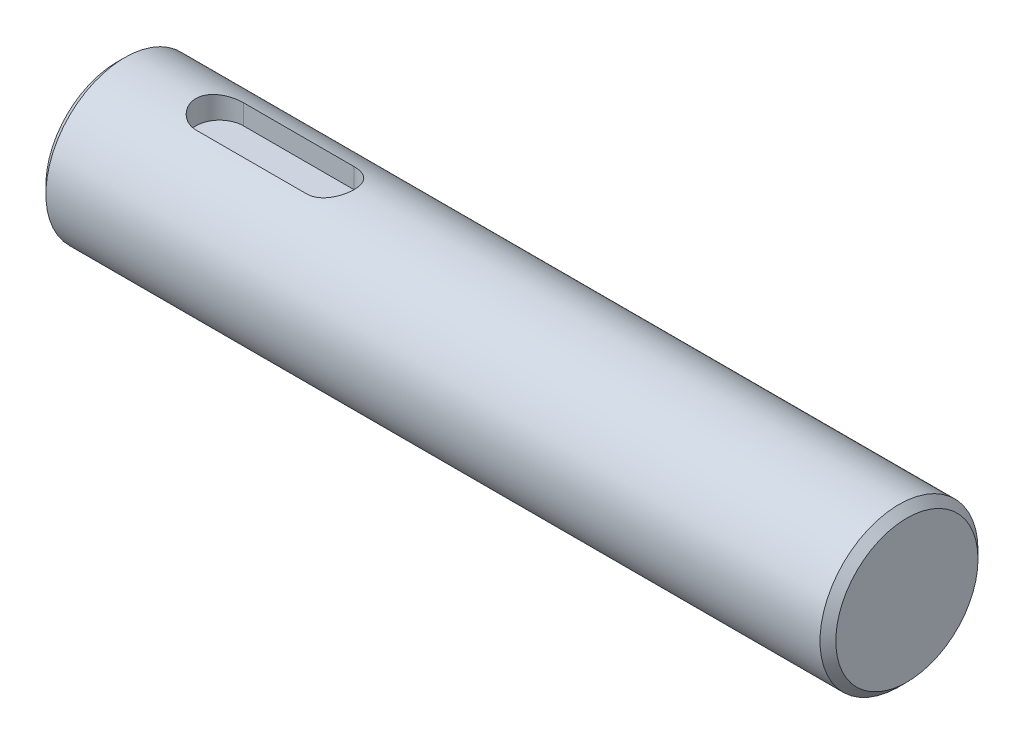
ISO-10303-21;
HEADER;
FILE_DESCRIPTION(('STEP AP214'),'2;1');
FILE_NAME('part.step','',(''),(''),'','','');
FILE_SCHEMA(('AUTOMOTIVE_DESIGN { 1 0 10303 214 1 1 1 1 }'));
ENDSEC;
DATA;
#1=APPLICATION_CONTEXT('core data for automotive mechanical design processes');
#2=APPLICATION_PROTOCOL_DEFINITION('international standard','automotive_design',2000,#1);
#3=PRODUCT_CONTEXT('',#1,'mechanical');
#4=PRODUCT('Part','Part','',(#3));
#5=PRODUCT_RELATED_PRODUCT_CATEGORY('part','',(#4));
#6=PRODUCT_DEFINITION_FORMATION('','',#4);
#7=PRODUCT_DEFINITION_CONTEXT('part definition',#1,'design');
#8=PRODUCT_DEFINITION('design','',#6,#7);
#9=PRODUCT_DEFINITION_SHAPE('','',#8);
#10=(LENGTH_UNIT() NAMED_UNIT(*) SI_UNIT(.MILLI.,.METRE.));
#11=(NAMED_UNIT(*) PLANE_ANGLE_UNIT() SI_UNIT($,.RADIAN.));
#12=(NAMED_UNIT(*) SI_UNIT($,.STERADIAN.) SOLID_ANGLE_UNIT());
#13=UNCERTAINTY_MEASURE_WITH_UNIT(LENGTH_MEASURE(1.E-05),#10,'distance_accuracy_value','');
#14=(GEOMETRIC_REPRESENTATION_CONTEXT(3) GLOBAL_UNCERTAINTY_ASSIGNED_CONTEXT((#13)) GLOBAL_UNIT_ASSIGNED_CONTEXT((#10,
#11,#12)) REPRESENTATION_CONTEXT('',''));
#15=CARTESIAN_POINT('',(0.,0.,0.));
#16=DIRECTION('',(0.,0.,1.));
#17=DIRECTION('',(1.,0.,0.));
#18=AXIS2_PLACEMENT_3D('',#15,#16,#17);
#19=CARTESIAN_POINT('',(100.,0.,0.));
#20=DIRECTION('',(-1.,0.,0.));
#21=DIRECTION('',(0.,0.,1.));
#22=AXIS2_PLACEMENT_3D('',#19,#20,#21);
#23=CYLINDRICAL_SURFACE('',#22,10.);
#24=CARTESIAN_POINT('',(99.,0.,0.));
#25=DIRECTION('',(1.,0.,0.));
#26=DIRECTION('',(0.,0.,-1.));
#27=AXIS2_PLACEMENT_3D('',#24,#25,#26);
#28=CIRCLE('',#27,10.);
#29=CARTESIAN_POINT('',(99.,0.,-10.));
#30=VERTEX_POINT('',#29);
#31=EDGE_CURVE('E11',#30,#30,#28,.F.);
#32=ORIENTED_EDGE('',*,*,#31,.T.);
#33=EDGE_LOOP('',(#32));
#34=FACE_BOUND('',#33,.T.);
#35=CARTESIAN_POINT('',(0.999999999999959,0.,0.));
#36=DIRECTION('',(1.,0.,0.));
#37=DIRECTION('',(0.,0.,-1.));
#38=AXIS2_PLACEMENT_3D('',#35,#36,#37);
#39=CIRCLE('',#38,10.);
#40=CARTESIAN_POINT('',(0.999999999999959,0.,-10.));
#41=VERTEX_POINT('',#40);
#42=EDGE_CURVE('E174',#41,#41,#39,.T.);
#43=ORIENTED_EDGE('',*,*,#42,.T.);
#44=EDGE_LOOP('',(#43));
#45=FACE_BOUND('',#44,.T.);
#46=DIRECTION('',(-1.,0.,0.));
#47=VECTOR('',#46,1.);
#48=CARTESIAN_POINT('',(100.,9.53939201416946,-3.));
#49=LINE('',#48,#47);
#50=CARTESIAN_POINT('',(13.,9.53939201416946,-3.));
#51=VERTEX_POINT('',#50);
#52=CARTESIAN_POINT('',(27.,9.53939201416946,-3.));
#53=VERTEX_POINT('',#52);
#54=EDGE_CURVE('E70',#51,#53,#49,.F.);
#55=ORIENTED_EDGE('',*,*,#54,.T.);
#56=CARTESIAN_POINT('',(27.,9.53939201416946,-3.));
#57=CARTESIAN_POINT('',(27.0823355208227,9.53938054248207,-3.00001027845728));
#58=CARTESIAN_POINT('',(27.1646644550632,9.54045772064378,-2.99661062684472));
#59=CARTESIAN_POINT('',(27.3286939527655,9.54470412105986,-2.98307142899347));
#60=CARTESIAN_POINT('',(27.4103946533244,9.54787287296848,-2.97293339805418));
#61=CARTESIAN_POINT('',(27.5723849156732,9.55620668351003,-2.94603140625045));
#62=CARTESIAN_POINT('',(27.652677524043,9.56136667250114,-2.92928426957737));
#63=CARTESIAN_POINT('',(27.8114758441342,9.57351626651178,-2.88932853030395));
#64=CARTESIAN_POINT('',(27.8899815090674,9.58050591937828,-2.86611975872641));
#65=CARTESIAN_POINT('',(28.1219493879901,9.60391637654137,-2.78708584446024));
#66=CARTESIAN_POINT('',(28.272068438833,9.62279007830391,-2.72181852542972));
#67=CARTESIAN_POINT('',(28.559226043979,9.66493213967819,-2.56815043531276));
#68=CARTESIAN_POINT('',(28.6962584707622,9.6882025429064,-2.4797388992416));
#69=CARTESIAN_POINT('',(28.9577229879478,9.73733650515374,-2.27929879634443));
#70=CARTESIAN_POINT('',(29.0816848740609,9.76325505469874,-2.16666914746584));
#71=CARTESIAN_POINT('',(29.3092736148388,9.81429628475077,-1.92227736150433));
#72=CARTESIAN_POINT('',(29.412897033861,9.8394188301941,-1.79051199848164));
#73=CARTESIAN_POINT('',(29.5989268650946,9.88666477976534,-1.50821997465697));
#74=CARTESIAN_POINT('',(29.6808501797826,9.90871541546877,-1.35736167401016));
#75=CARTESIAN_POINT('',(29.8179770040029,9.94668940088144,-1.04324233568303));
#76=CARTESIAN_POINT('',(29.873187403368,9.96261433032403,-0.879984508687986));
#77=CARTESIAN_POINT('',(29.953759551791,9.98615279768398,-0.550649404820603));
#78=CARTESIAN_POINT('',(29.9799297035176,9.99399098526792,-0.384786253016205));
#79=CARTESIAN_POINT('',(30.004234695146,10.0012640407204,-0.0508471415689293));
#80=CARTESIAN_POINT('',(30.0023748426782,10.0007004995012,0.117228393125337));
#81=CARTESIAN_POINT('',(29.9712141793086,9.99139205125586,0.445143199271823));
#82=CARTESIAN_POINT('',(29.9427893091919,9.98290831016512,0.605074290763026));
#83=CARTESIAN_POINT('',(29.8607367303745,9.95903027401822,0.917780104370312));
#84=CARTESIAN_POINT('',(29.8071077013173,9.94363561692558,1.07055445110879));
#85=CARTESIAN_POINT('',(29.6755755564753,9.90730429851782,1.36669563173911));
#86=CARTESIAN_POINT('',(29.5973967112239,9.88630511384915,1.50993201207612));
#87=CARTESIAN_POINT('',(29.4192028199656,9.84099249303647,1.781531059161));
#88=CARTESIAN_POINT('',(29.3191828810593,9.81667831471806,1.9098903832325));
#89=CARTESIAN_POINT('',(29.0956160238154,9.7662334714278,2.15330901082205));
#90=CARTESIAN_POINT('',(28.9713122724738,9.74006890899097,2.26766702955975));
#91=CARTESIAN_POINT('',(28.7050051531489,9.68968430229327,2.47413538985067));
#92=CARTESIAN_POINT('',(28.5629966392702,9.66546482675134,2.5662392402618));
#93=CARTESIAN_POINT('',(28.2634381431001,9.62154457591303,2.72632814481701));
#94=CARTESIAN_POINT('',(28.1057456408129,9.60189192491895,2.79406012682262));
#95=CARTESIAN_POINT('',(27.7805509920369,9.56991327306402,2.90171772009404));
#96=CARTESIAN_POINT('',(27.6130642785713,9.55757606951749,2.94168586436072));
#97=CARTESIAN_POINT('',(27.3700102218596,9.54628064650012,2.97802407180159));
#98=CARTESIAN_POINT('',(27.2962185316408,9.54370312550533,2.98626405978017));
#99=CARTESIAN_POINT('',(27.148297041801,9.54025857223564,2.99724711229708));
#100=CARTESIAN_POINT('',(27.0741679006723,9.53938902493288,2.99999825936538));
#101=CARTESIAN_POINT('',(27.,9.53939201416946,3.));
#102=B_SPLINE_CURVE_WITH_KNOTS('',3,(#56,#57,#58,#59,#60,#61,#62,#63,#64,#65,#66,#67,#68,#69,
#70,#71,#72,#73,#74,#75,#76,#77,#78,#79,#80,#81,#82,#83,#84,#85,#86,#87,#88,#89,#90,#91,#92,#93,
#94,#95,#96,#97,#98,#99,#100,#101),.UNSPECIFIED.,.F.,.F.,(4,2,2,2,2,2,2,2,2,2,2,2,2,2,2,2,2,2,2,
2,2,2,4),(0.,0.246918142439467,0.493780777706087,0.740019009623012,0.986263681482023,
1.47813347402025,1.97023245590779,2.47635119822766,2.98255536239033,3.4992281062007,
4.01576751791672,4.51753600864764,5.019209488041,5.50490358251092,5.99062312360831,
6.48200583350621,6.97349873739169,7.48389234847121,7.99443465298714,8.51013494368214,
9.02504345105574,9.24774267716777,9.47011372732391),.UNSPECIFIED.);
#103=CARTESIAN_POINT('',(27.,9.53939201416946,3.));
#104=VERTEX_POINT('',#103);
#105=EDGE_CURVE('E121',#53,#104,#102,.T.);
#106=ORIENTED_EDGE('',*,*,#105,.T.);
#107=DIRECTION('',(-1.,0.,0.));
#108=VECTOR('',#107,1.);
#109=CARTESIAN_POINT('',(100.,9.53939201416946,3.));
#110=LINE('',#109,#108);
#111=CARTESIAN_POINT('',(13.,9.53939201416946,3.));
#112=VERTEX_POINT('',#111);
#113=EDGE_CURVE('E176',#104,#112,#110,.T.);
#114=ORIENTED_EDGE('',*,*,#113,.T.);
#115=CARTESIAN_POINT('',(13.,9.53939201416946,3.));
#116=CARTESIAN_POINT('',(12.9176644791773,9.53938054248207,3.00001027845728));
#117=CARTESIAN_POINT('',(12.8353355449368,9.54045772064378,2.99661062684472));
#118=CARTESIAN_POINT('',(12.6713060472345,9.54470412105986,2.98307142899347));
#119=CARTESIAN_POINT('',(12.5896053466756,9.54787287296848,2.97293339805418));
#120=CARTESIAN_POINT('',(12.4276150843268,9.55620668351003,2.94603140625045));
#121=CARTESIAN_POINT('',(12.347322475957,9.56136667250114,2.92928426957737));
#122=CARTESIAN_POINT('',(12.1885241558658,9.57351626651178,2.88932853030395));
#123=CARTESIAN_POINT('',(12.1100184909326,9.58050591937828,2.86611975872641));
#124=CARTESIAN_POINT('',(11.8780506120099,9.60391637654137,2.78708584446024));
#125=CARTESIAN_POINT('',(11.727931561167,9.62279007830391,2.72181852542972));
#126=CARTESIAN_POINT('',(11.440773956021,9.66493213967819,2.56815043531276));
#127=CARTESIAN_POINT('',(11.3037415292378,9.6882025429064,2.4797388992416));
#128=CARTESIAN_POINT('',(11.0422770120522,9.73733650515374,2.27929879634442));
#129=CARTESIAN_POINT('',(10.9183151259391,9.76325505469874,2.16666914746584));
#130=CARTESIAN_POINT('',(10.6907263851612,9.81429628475077,1.92227736150433));
#131=CARTESIAN_POINT('',(10.587102966139,9.8394188301941,1.79051199848164));
#132=CARTESIAN_POINT('',(10.4010731349054,9.88666477976534,1.50821997465697));
#133=CARTESIAN_POINT('',(10.3191498202174,9.90871541546877,1.35736167401016));
#134=CARTESIAN_POINT('',(10.1820229959971,9.94668940088144,1.04324233568303));
#135=CARTESIAN_POINT('',(10.126812596632,9.96261433032403,0.879984508687984));
#136=CARTESIAN_POINT('',(10.046240448209,9.98615279768398,0.550649404820601));
#137=CARTESIAN_POINT('',(10.0200702964824,9.99399098526792,0.384786253016202));
#138=CARTESIAN_POINT('',(9.99576530485396,10.0012640407204,0.0508471415689264));
#139=CARTESIAN_POINT('',(9.99762515732182,10.0007004995012,-0.117228393125341));
#140=CARTESIAN_POINT('',(10.0287858206914,9.99139205125586,-0.445143199271826));
#141=CARTESIAN_POINT('',(10.0572106908081,9.98290831016512,-0.605074290763029));
#142=CARTESIAN_POINT('',(10.1392632696255,9.95903027401822,-0.917780104370315));
#143=CARTESIAN_POINT('',(10.1928922986827,9.94363561692558,-1.07055445110879));
#144=CARTESIAN_POINT('',(10.3244244435248,9.90730429851782,-1.36669563173912));
#145=CARTESIAN_POINT('',(10.4026032887761,9.88630511384915,-1.50993201207613));
#146=CARTESIAN_POINT('',(10.5807971800344,9.84099249303646,-1.781531059161));
#147=CARTESIAN_POINT('',(10.6808171189407,9.81667831471806,-1.90989038323251));
#148=CARTESIAN_POINT('',(10.9043839761846,9.7662334714278,-2.15330901082206));
#149=CARTESIAN_POINT('',(11.0286877275262,9.74006890899097,-2.26766702955975));
#150=CARTESIAN_POINT('',(11.2949948468511,9.68968430229327,-2.47413538985067));
#151=CARTESIAN_POINT('',(11.4370033607298,9.66546482675134,-2.5662392402618));
#152=CARTESIAN_POINT('',(11.7365618568999,9.62154457591303,-2.72632814481701));
#153=CARTESIAN_POINT('',(11.8942543591871,9.60189192491895,-2.79406012682263));
#154=CARTESIAN_POINT('',(12.2194490079631,9.56991327306402,-2.90171772009404));
#155=CARTESIAN_POINT('',(12.3869357214287,9.55757606951749,-2.94168586436072));
#156=CARTESIAN_POINT('',(12.6299897781404,9.54628064650011,-2.97802407180159));
#157=CARTESIAN_POINT('',(12.7037814683592,9.54370312550533,-2.98626405978017));
#158=CARTESIAN_POINT('',(12.851702958199,9.54025857223564,-2.99724711229708));
#159=CARTESIAN_POINT('',(12.9258320993277,9.53938902493288,-2.99999825936538));
#160=CARTESIAN_POINT('',(13.,9.53939201416946,-3.));
#161=B_SPLINE_CURVE_WITH_KNOTS('',3,(#115,#116,#117,#118,#119,#120,#121,#122,#123,#124,#125,
#126,#127,#128,#129,#130,#131,#132,#133,#134,#135,#136,#137,#138,#139,#140,#141,#142,#143,#144,
#145,#146,#147,#148,#149,#150,#151,#152,#153,#154,#155,#156,#157,#158,#159,#160),.UNSPECIFIED.,
.F.,.F.,(4,2,2,2,2,2,2,2,2,2,2,2,2,2,2,2,2,2,2,2,2,2,4),(0.,0.246918142439467,0.493780777706085,
0.740019009623011,0.986263681482025,1.47813347402025,1.97023245590779,2.47635119822767,
2.98255536239033,3.49922810620071,4.01576751791672,4.51753600864764,5.01920948804101,
5.50490358251093,5.99062312360832,6.48200583350621,6.9734987373917,7.48389234847122,
7.99443465298715,8.51013494368214,9.02504345105574,9.24774267716778,9.47011372732391),.UNSPECIFIED.);
#162=EDGE_CURVE('E62',#112,#51,#161,.T.);
#163=ORIENTED_EDGE('',*,*,#162,.T.);
#164=EDGE_LOOP('',(#55,#106,#114,#163));
#165=FACE_BOUND('',#164,.T.);
#166=ADVANCED_FACE('F45',(#34,#45,#165),#23,.T.);
#167=CARTESIAN_POINT('',(100.,0.,0.));
#168=DIRECTION('',(1.,0.,0.));
#169=DIRECTION('',(0.,0.,-1.));
#170=AXIS2_PLACEMENT_3D('',#167,#168,#169);
#171=PLANE('',#170);
#172=CARTESIAN_POINT('',(100.,0.,0.));
#173=DIRECTION('',(1.,0.,0.));
#174=DIRECTION('',(0.,0.,-1.));
#175=AXIS2_PLACEMENT_3D('',#172,#173,#174);
#176=CIRCLE('',#175,9.00000000000001);
#177=CARTESIAN_POINT('',(100.,0.,-9.00000000000001));
#178=VERTEX_POINT('',#177);
#179=EDGE_CURVE('E55',#178,#178,#176,.T.);
#180=ORIENTED_EDGE('',*,*,#179,.T.);
#181=EDGE_LOOP('',(#180));
#182=FACE_BOUND('',#181,.T.);
#183=ADVANCED_FACE('F157',(#182),#171,.T.);
#184=CARTESIAN_POINT('',(0.,0.,0.));
#185=DIRECTION('',(1.,0.,0.));
#186=DIRECTION('',(0.,0.,-1.));
#187=AXIS2_PLACEMENT_3D('',#184,#185,#186);
#188=PLANE('',#187);
#189=CARTESIAN_POINT('',(0.,0.,0.));
#190=DIRECTION('',(1.,0.,0.));
#191=DIRECTION('',(0.,0.,-1.));
#192=AXIS2_PLACEMENT_3D('',#189,#190,#191);
#193=CIRCLE('',#192,9.00000000000004);
#194=CARTESIAN_POINT('',(0.,0.,-9.00000000000004));
#195=VERTEX_POINT('',#194);
#196=EDGE_CURVE('E180',#195,#195,#193,.F.);
#197=ORIENTED_EDGE('',*,*,#196,.T.);
#198=EDGE_LOOP('',(#197));
#199=FACE_BOUND('',#198,.T.);
#200=ADVANCED_FACE('F156',(#199),#188,.F.);
#201=CARTESIAN_POINT('',(13.,7.,0.));
#202=DIRECTION('',(0.,1.,0.));
#203=DIRECTION('',(0.,0.,1.));
#204=AXIS2_PLACEMENT_3D('',#201,#202,#203);
#205=CYLINDRICAL_SURFACE('',#204,3.);
#206=DIRECTION('',(0.,1.,0.));
#207=VECTOR('',#206,1.);
#208=CARTESIAN_POINT('',(13.,7.,3.));
#209=LINE('',#208,#207);
#210=CARTESIAN_POINT('',(13.,7.,3.));
#211=VERTEX_POINT('',#210);
#212=EDGE_CURVE('E87',#211,#112,#209,.T.);
#213=ORIENTED_EDGE('',*,*,#212,.F.);
#214=CARTESIAN_POINT('',(13.,7.,0.));
#215=DIRECTION('',(0.,1.,0.));
#216=DIRECTION('',(0.,0.,1.));
#217=AXIS2_PLACEMENT_3D('',#214,#215,#216);
#218=CIRCLE('',#217,3.);
#219=CARTESIAN_POINT('',(13.,7.,-3.));
#220=VERTEX_POINT('',#219);
#221=EDGE_CURVE('E91',#220,#211,#218,.T.);
#222=ORIENTED_EDGE('',*,*,#221,.F.);
#223=DIRECTION('',(0.,1.,0.));
#224=VECTOR('',#223,1.);
#225=CARTESIAN_POINT('',(13.,7.,-3.));
#226=LINE('',#225,#224);
#227=EDGE_CURVE('E118',#220,#51,#226,.T.);
#228=ORIENTED_EDGE('',*,*,#227,.T.);
#229=ORIENTED_EDGE('',*,*,#162,.F.);
#230=EDGE_LOOP('',(#213,#222,#228,#229));
#231=FACE_BOUND('',#230,.T.);
#232=ADVANCED_FACE('F89',(#231),#205,.F.);
#233=CARTESIAN_POINT('',(13.,7.,-3.));
#234=DIRECTION('',(0.,0.,-1.));
#235=DIRECTION('',(-1.,0.,0.));
#236=AXIS2_PLACEMENT_3D('',#233,#234,#235);
#237=PLANE('',#236);
#238=ORIENTED_EDGE('',*,*,#227,.F.);
#239=DIRECTION('',(-1.,0.,0.));
#240=VECTOR('',#239,1.);
#241=CARTESIAN_POINT('',(13.,7.,-3.));
#242=LINE('',#241,#240);
#243=CARTESIAN_POINT('',(27.,7.,-3.));
#244=VERTEX_POINT('',#243);
#245=EDGE_CURVE('E97',#244,#220,#242,.T.);
#246=ORIENTED_EDGE('',*,*,#245,.F.);
#247=DIRECTION('',(0.,1.,0.));
#248=VECTOR('',#247,1.);
#249=CARTESIAN_POINT('',(27.,7.,-3.));
#250=LINE('',#249,#248);
#251=EDGE_CURVE('E122',#244,#53,#250,.T.);
#252=ORIENTED_EDGE('',*,*,#251,.T.);
#253=ORIENTED_EDGE('',*,*,#54,.F.);
#254=EDGE_LOOP('',(#238,#246,#252,#253));
#255=FACE_BOUND('',#254,.T.);
#256=ADVANCED_FACE('F149',(#255),#237,.F.);
#257=CARTESIAN_POINT('',(27.,7.,0.));
#258=DIRECTION('',(0.,1.,0.));
#259=DIRECTION('',(0.,0.,1.));
#260=AXIS2_PLACEMENT_3D('',#257,#258,#259);
#261=CYLINDRICAL_SURFACE('',#260,3.);
#262=ORIENTED_EDGE('',*,*,#251,.F.);
#263=CARTESIAN_POINT('',(27.,7.,0.));
#264=DIRECTION('',(0.,1.,0.));
#265=DIRECTION('',(0.,0.,-1.));
#266=AXIS2_PLACEMENT_3D('',#263,#264,#265);
#267=CIRCLE('',#266,3.);
#268=CARTESIAN_POINT('',(27.,7.,3.));
#269=VERTEX_POINT('',#268);
#270=EDGE_CURVE('E107',#269,#244,#267,.T.);
#271=ORIENTED_EDGE('',*,*,#270,.F.);
#272=DIRECTION('',(0.,1.,0.));
#273=VECTOR('',#272,1.);
#274=CARTESIAN_POINT('',(27.,7.,3.));
#275=LINE('',#274,#273);
#276=EDGE_CURVE('E96',#269,#104,#275,.T.);
#277=ORIENTED_EDGE('',*,*,#276,.T.);
#278=ORIENTED_EDGE('',*,*,#105,.F.);
#279=EDGE_LOOP('',(#262,#271,#277,#278));
#280=FACE_BOUND('',#279,.T.);
#281=ADVANCED_FACE('F144',(#280),#261,.F.);
#282=CARTESIAN_POINT('',(13.,7.,3.));
#283=DIRECTION('',(0.,0.,1.));
#284=DIRECTION('',(1.,0.,0.));
#285=AXIS2_PLACEMENT_3D('',#282,#283,#284);
#286=PLANE('',#285);
#287=ORIENTED_EDGE('',*,*,#276,.F.);
#288=DIRECTION('',(1.,0.,0.));
#289=VECTOR('',#288,1.);
#290=CARTESIAN_POINT('',(13.,7.,3.));
#291=LINE('',#290,#289);
#292=EDGE_CURVE('E100',#211,#269,#291,.T.);
#293=ORIENTED_EDGE('',*,*,#292,.F.);
#294=ORIENTED_EDGE('',*,*,#212,.T.);
#295=ORIENTED_EDGE('',*,*,#113,.F.);
#296=EDGE_LOOP('',(#287,#293,#294,#295));
#297=FACE_BOUND('',#296,.T.);
#298=ADVANCED_FACE('F101',(#297),#286,.F.);
#299=CARTESIAN_POINT('',(13.,7.,0.));
#300=DIRECTION('',(0.,1.,0.));
#301=DIRECTION('',(0.,0.,1.));
#302=AXIS2_PLACEMENT_3D('',#299,#300,#301);
#303=PLANE('',#302);
#304=ORIENTED_EDGE('',*,*,#221,.T.);
#305=ORIENTED_EDGE('',*,*,#292,.T.);
#306=ORIENTED_EDGE('',*,*,#270,.T.);
#307=ORIENTED_EDGE('',*,*,#245,.T.);
#308=EDGE_LOOP('',(#304,#305,#306,#307));
#309=FACE_BOUND('',#308,.T.);
#310=ADVANCED_FACE('F109',(#309),#303,.T.);
#311=CARTESIAN_POINT('',(0.999999999999959,0.,0.));
#312=DIRECTION('',(1.,0.,0.));
#313=DIRECTION('',(0.,0.,-1.));
#314=AXIS2_PLACEMENT_3D('',#311,#312,#313);
#315=CONICAL_SURFACE('',#314,10.,0.785398163397451);
#316=ORIENTED_EDGE('',*,*,#196,.F.);
#317=EDGE_LOOP('',(#316));
#318=FACE_BOUND('',#317,.T.);
#319=ORIENTED_EDGE('',*,*,#42,.F.);
#320=EDGE_LOOP('',(#319));
#321=FACE_BOUND('',#320,.T.);
#322=ADVANCED_FACE('F189',(#318,#321),#315,.T.);
#323=CARTESIAN_POINT('',(100.,0.,0.));
#324=DIRECTION('',(-1.,0.,0.));
#325=DIRECTION('',(0.,0.,1.));
#326=AXIS2_PLACEMENT_3D('',#323,#324,#325);
#327=CONICAL_SURFACE('',#326,9.00000000000001,0.785398163397451);
#328=ORIENTED_EDGE('',*,*,#31,.F.);
#329=EDGE_LOOP('',(#328));
#330=FACE_BOUND('',#329,.T.);
#331=ORIENTED_EDGE('',*,*,#179,.F.);
#332=EDGE_LOOP('',(#331));
#333=FACE_BOUND('',#332,.T.);
#334=ADVANCED_FACE('F48',(#330,#333),#327,.T.);
#335=CLOSED_SHELL('',(#166,#183,#200,#232,#256,#281,#298,#310,#322,#334));
#336=MANIFOLD_SOLID_BREP('B2',#335);
#337=ADVANCED_BREP_SHAPE_REPRESENTATION('',(#18,#336),#14);
#338=SHAPE_DEFINITION_REPRESENTATION(#9,#337);
ENDSEC;
END-ISO-10303-21;
